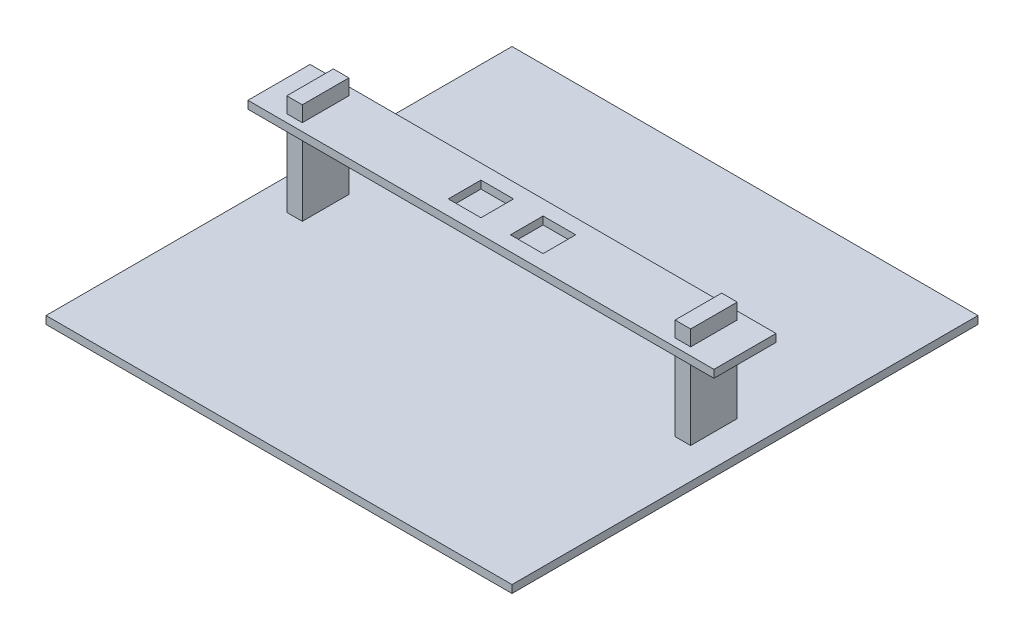
ISO-10303-21;
HEADER;
FILE_DESCRIPTION(('STEP AP214'),'2;1');
FILE_NAME('part.step','',(''),(''),'','','');
FILE_SCHEMA(('AUTOMOTIVE_DESIGN { 1 0 10303 214 1 1 1 1 }'));
ENDSEC;
DATA;
#1=APPLICATION_CONTEXT('core data for automotive mechanical design processes');
#2=APPLICATION_PROTOCOL_DEFINITION('international standard','automotive_design',2000,#1);
#3=PRODUCT_CONTEXT('',#1,'mechanical');
#4=PRODUCT('Part','Part','',(#3));
#5=PRODUCT_RELATED_PRODUCT_CATEGORY('part','',(#4));
#6=PRODUCT_DEFINITION_FORMATION('','',#4);
#7=PRODUCT_DEFINITION_CONTEXT('part definition',#1,'design');
#8=PRODUCT_DEFINITION('design','',#6,#7);
#9=PRODUCT_DEFINITION_SHAPE('','',#8);
#10=(LENGTH_UNIT() NAMED_UNIT(*) SI_UNIT(.MILLI.,.METRE.));
#11=(NAMED_UNIT(*) PLANE_ANGLE_UNIT() SI_UNIT($,.RADIAN.));
#12=(NAMED_UNIT(*) SI_UNIT($,.STERADIAN.) SOLID_ANGLE_UNIT());
#13=UNCERTAINTY_MEASURE_WITH_UNIT(LENGTH_MEASURE(1.E-05),#10,'distance_accuracy_value','');
#14=(GEOMETRIC_REPRESENTATION_CONTEXT(3) GLOBAL_UNCERTAINTY_ASSIGNED_CONTEXT((#13)) GLOBAL_UNIT_ASSIGNED_CONTEXT((#10,
#11,#12)) REPRESENTATION_CONTEXT('',''));
#15=CARTESIAN_POINT('',(0.,0.,0.));
#16=DIRECTION('',(0.,0.,1.));
#17=DIRECTION('',(1.,0.,0.));
#18=AXIS2_PLACEMENT_3D('',#15,#16,#17);
#19=CARTESIAN_POINT('',(0.,120.,0.));
#20=DIRECTION('',(0.,1.,0.));
#21=DIRECTION('',(0.,0.,1.));
#22=AXIS2_PLACEMENT_3D('',#19,#20,#21);
#23=PLANE('',#22);
#24=DIRECTION('',(0.,0.,1.));
#25=VECTOR('',#24,1.);
#26=CARTESIAN_POINT('',(-61.,120.,-21.));
#27=LINE('',#26,#25);
#28=CARTESIAN_POINT('',(-61.,120.,-21.));
#29=VERTEX_POINT('',#28);
#30=CARTESIAN_POINT('',(-61.,120.,21.));
#31=VERTEX_POINT('',#30);
#32=EDGE_CURVE('E64',#29,#31,#27,.T.);
#33=ORIENTED_EDGE('',*,*,#32,.F.);
#34=DIRECTION('',(-1.,0.,0.));
#35=VECTOR('',#34,1.);
#36=CARTESIAN_POINT('',(-19.,120.,-21.));
#37=LINE('',#36,#35);
#38=CARTESIAN_POINT('',(-19.,120.,-21.));
#39=VERTEX_POINT('',#38);
#40=EDGE_CURVE('E278',#39,#29,#37,.T.);
#41=ORIENTED_EDGE('',*,*,#40,.F.);
#42=DIRECTION('',(0.,0.,-1.));
#43=VECTOR('',#42,1.);
#44=CARTESIAN_POINT('',(-19.,120.,21.));
#45=LINE('',#44,#43);
#46=CARTESIAN_POINT('',(-19.,120.,21.));
#47=VERTEX_POINT('',#46);
#48=EDGE_CURVE('E282',#47,#39,#45,.T.);
#49=ORIENTED_EDGE('',*,*,#48,.F.);
#50=DIRECTION('',(1.,0.,0.));
#51=VECTOR('',#50,1.);
#52=CARTESIAN_POINT('',(-61.,120.,21.));
#53=LINE('',#52,#51);
#54=EDGE_CURVE('E286',#31,#47,#53,.T.);
#55=ORIENTED_EDGE('',*,*,#54,.F.);
#56=EDGE_LOOP('',(#33,#41,#49,#55));
#57=FACE_BOUND('',#56,.T.);
#58=DIRECTION('',(0.,0.,-1.));
#59=VECTOR('',#58,1.);
#60=CARTESIAN_POINT('',(61.0000000000001,120.,21.));
#61=LINE('',#60,#59);
#62=CARTESIAN_POINT('',(61.0000000000001,120.,21.));
#63=VERTEX_POINT('',#62);
#64=CARTESIAN_POINT('',(61.0000000000001,120.,-21.));
#65=VERTEX_POINT('',#64);
#66=EDGE_CURVE('E71',#63,#65,#61,.T.);
#67=ORIENTED_EDGE('',*,*,#66,.F.);
#68=DIRECTION('',(1.,0.,0.));
#69=VECTOR('',#68,1.);
#70=CARTESIAN_POINT('',(19.0000000000001,120.,21.));
#71=LINE('',#70,#69);
#72=CARTESIAN_POINT('',(19.0000000000001,120.,21.));
#73=VERTEX_POINT('',#72);
#74=EDGE_CURVE('E306',#73,#63,#71,.T.);
#75=ORIENTED_EDGE('',*,*,#74,.F.);
#76=DIRECTION('',(0.,0.,1.));
#77=VECTOR('',#76,1.);
#78=CARTESIAN_POINT('',(19.0000000000001,120.,-21.));
#79=LINE('',#78,#77);
#80=CARTESIAN_POINT('',(19.0000000000001,120.,-21.));
#81=VERTEX_POINT('',#80);
#82=EDGE_CURVE('E313',#81,#73,#79,.T.);
#83=ORIENTED_EDGE('',*,*,#82,.F.);
#84=DIRECTION('',(-1.,0.,0.));
#85=VECTOR('',#84,1.);
#86=CARTESIAN_POINT('',(61.0000000000001,120.,-21.));
#87=LINE('',#86,#85);
#88=EDGE_CURVE('E312',#65,#81,#87,.T.);
#89=ORIENTED_EDGE('',*,*,#88,.F.);
#90=EDGE_LOOP('',(#67,#75,#83,#89));
#91=FACE_BOUND('',#90,.T.);
#92=DIRECTION('',(0.,0.,-1.));
#93=VECTOR('',#92,1.);
#94=CARTESIAN_POINT('',(-240.,120.,30.));
#95=LINE('',#94,#93);
#96=CARTESIAN_POINT('',(-240.,120.,30.));
#97=VERTEX_POINT('',#96);
#98=CARTESIAN_POINT('',(-240.,120.,-30.));
#99=VERTEX_POINT('',#98);
#100=EDGE_CURVE('E369',#97,#99,#95,.T.);
#101=ORIENTED_EDGE('',*,*,#100,.F.);
#102=DIRECTION('',(1.,0.,0.));
#103=VECTOR('',#102,1.);
#104=CARTESIAN_POINT('',(-260.,120.,30.));
#105=LINE('',#104,#103);
#106=CARTESIAN_POINT('',(-260.,120.,30.));
#107=VERTEX_POINT('',#106);
#108=EDGE_CURVE('E368',#107,#97,#105,.T.);
#109=ORIENTED_EDGE('',*,*,#108,.F.);
#110=DIRECTION('',(0.,0.,1.));
#111=VECTOR('',#110,1.);
#112=CARTESIAN_POINT('',(-260.,120.,-30.));
#113=LINE('',#112,#111);
#114=CARTESIAN_POINT('',(-260.,120.,-30.));
#115=VERTEX_POINT('',#114);
#116=EDGE_CURVE('E376',#115,#107,#113,.T.);
#117=ORIENTED_EDGE('',*,*,#116,.F.);
#118=DIRECTION('',(-1.,0.,0.));
#119=VECTOR('',#118,1.);
#120=CARTESIAN_POINT('',(-240.,120.,-30.));
#121=LINE('',#120,#119);
#122=EDGE_CURVE('E373',#99,#115,#121,.T.);
#123=ORIENTED_EDGE('',*,*,#122,.F.);
#124=EDGE_LOOP('',(#101,#109,#117,#123));
#125=FACE_BOUND('',#124,.T.);
#126=DIRECTION('',(0.,0.,-1.));
#127=VECTOR('',#126,1.);
#128=CARTESIAN_POINT('',(260.,120.,30.));
#129=LINE('',#128,#127);
#130=CARTESIAN_POINT('',(260.,120.,30.));
#131=VERTEX_POINT('',#130);
#132=CARTESIAN_POINT('',(260.,120.,-30.));
#133=VERTEX_POINT('',#132);
#134=EDGE_CURVE('E351',#131,#133,#129,.T.);
#135=ORIENTED_EDGE('',*,*,#134,.F.);
#136=DIRECTION('',(1.,0.,0.));
#137=VECTOR('',#136,1.);
#138=CARTESIAN_POINT('',(240.,120.,30.));
#139=LINE('',#138,#137);
#140=CARTESIAN_POINT('',(240.,120.,30.));
#141=VERTEX_POINT('',#140);
#142=EDGE_CURVE('E349',#141,#131,#139,.T.);
#143=ORIENTED_EDGE('',*,*,#142,.F.);
#144=DIRECTION('',(0.,0.,1.));
#145=VECTOR('',#144,1.);
#146=CARTESIAN_POINT('',(240.,120.,-30.));
#147=LINE('',#146,#145);
#148=CARTESIAN_POINT('',(240.,120.,-30.));
#149=VERTEX_POINT('',#148);
#150=EDGE_CURVE('E357',#149,#141,#147,.T.);
#151=ORIENTED_EDGE('',*,*,#150,.F.);
#152=DIRECTION('',(-1.,0.,0.));
#153=VECTOR('',#152,1.);
#154=CARTESIAN_POINT('',(260.,120.,-30.));
#155=LINE('',#154,#153);
#156=EDGE_CURVE('E353',#133,#149,#155,.T.);
#157=ORIENTED_EDGE('',*,*,#156,.F.);
#158=EDGE_LOOP('',(#135,#143,#151,#157));
#159=FACE_BOUND('',#158,.T.);
#160=DIRECTION('',(0.,0.,-1.));
#161=VECTOR('',#160,1.);
#162=CARTESIAN_POINT('',(300.,120.,300.));
#163=LINE('',#162,#161);
#164=CARTESIAN_POINT('',(300.,120.,40.));
#165=VERTEX_POINT('',#164);
#166=CARTESIAN_POINT('',(300.,120.,-40.));
#167=VERTEX_POINT('',#166);
#168=EDGE_CURVE('E388',#165,#167,#163,.T.);
#169=ORIENTED_EDGE('',*,*,#168,.T.);
#170=DIRECTION('',(-1.,0.,0.));
#171=VECTOR('',#170,1.);
#172=CARTESIAN_POINT('',(-300.,120.,-40.));
#173=LINE('',#172,#171);
#174=CARTESIAN_POINT('',(-300.,120.,-40.));
#175=VERTEX_POINT('',#174);
#176=EDGE_CURVE('E335',#167,#175,#173,.T.);
#177=ORIENTED_EDGE('',*,*,#176,.T.);
#178=DIRECTION('',(0.,0.,1.));
#179=VECTOR('',#178,1.);
#180=CARTESIAN_POINT('',(-300.,120.,-300.));
#181=LINE('',#180,#179);
#182=CARTESIAN_POINT('',(-300.,120.,40.));
#183=VERTEX_POINT('',#182);
#184=EDGE_CURVE('E392',#175,#183,#181,.T.);
#185=ORIENTED_EDGE('',*,*,#184,.T.);
#186=DIRECTION('',(1.,0.,0.));
#187=VECTOR('',#186,1.);
#188=CARTESIAN_POINT('',(-300.,120.,40.));
#189=LINE('',#188,#187);
#190=EDGE_CURVE('E293',#183,#165,#189,.T.);
#191=ORIENTED_EDGE('',*,*,#190,.T.);
#192=EDGE_LOOP('',(#169,#177,#185,#191));
#193=FACE_BOUND('',#192,.T.);
#194=ADVANCED_FACE('F49',(#57,#91,#125,#159,#193),#23,.T.);
#195=CARTESIAN_POINT('',(0.,110.,0.));
#196=DIRECTION('',(0.,1.,0.));
#197=DIRECTION('',(0.,0.,1.));
#198=AXIS2_PLACEMENT_3D('',#195,#196,#197);
#199=PLANE('',#198);
#200=DIRECTION('',(-1.,0.,0.));
#201=VECTOR('',#200,1.);
#202=CARTESIAN_POINT('',(-19.,110.,-21.));
#203=LINE('',#202,#201);
#204=CARTESIAN_POINT('',(-19.,110.,-21.));
#205=VERTEX_POINT('',#204);
#206=CARTESIAN_POINT('',(-61.,110.,-21.));
#207=VERTEX_POINT('',#206);
#208=EDGE_CURVE('E270',#205,#207,#203,.T.);
#209=ORIENTED_EDGE('',*,*,#208,.T.);
#210=DIRECTION('',(0.,0.,1.));
#211=VECTOR('',#210,1.);
#212=CARTESIAN_POINT('',(-61.,110.,-21.));
#213=LINE('',#212,#211);
#214=CARTESIAN_POINT('',(-61.,110.,21.));
#215=VERTEX_POINT('',#214);
#216=EDGE_CURVE('E261',#207,#215,#213,.T.);
#217=ORIENTED_EDGE('',*,*,#216,.T.);
#218=DIRECTION('',(1.,0.,0.));
#219=VECTOR('',#218,1.);
#220=CARTESIAN_POINT('',(-61.,110.,21.));
#221=LINE('',#220,#219);
#222=CARTESIAN_POINT('',(-19.,110.,21.));
#223=VERTEX_POINT('',#222);
#224=EDGE_CURVE('E271',#215,#223,#221,.T.);
#225=ORIENTED_EDGE('',*,*,#224,.T.);
#226=DIRECTION('',(0.,0.,-1.));
#227=VECTOR('',#226,1.);
#228=CARTESIAN_POINT('',(-19.,110.,21.));
#229=LINE('',#228,#227);
#230=EDGE_CURVE('E274',#223,#205,#229,.T.);
#231=ORIENTED_EDGE('',*,*,#230,.T.);
#232=EDGE_LOOP('',(#209,#217,#225,#231));
#233=FACE_BOUND('',#232,.T.);
#234=DIRECTION('',(1.,0.,0.));
#235=VECTOR('',#234,1.);
#236=CARTESIAN_POINT('',(19.0000000000001,110.,21.));
#237=LINE('',#236,#235);
#238=CARTESIAN_POINT('',(19.0000000000001,110.,21.));
#239=VERTEX_POINT('',#238);
#240=CARTESIAN_POINT('',(61.0000000000001,110.,21.));
#241=VERTEX_POINT('',#240);
#242=EDGE_CURVE('E302',#239,#241,#237,.T.);
#243=ORIENTED_EDGE('',*,*,#242,.T.);
#244=DIRECTION('',(0.,0.,-1.));
#245=VECTOR('',#244,1.);
#246=CARTESIAN_POINT('',(61.0000000000001,110.,21.));
#247=LINE('',#246,#245);
#248=CARTESIAN_POINT('',(61.0000000000001,110.,-21.));
#249=VERTEX_POINT('',#248);
#250=EDGE_CURVE('E315',#241,#249,#247,.T.);
#251=ORIENTED_EDGE('',*,*,#250,.T.);
#252=DIRECTION('',(-1.,0.,0.));
#253=VECTOR('',#252,1.);
#254=CARTESIAN_POINT('',(61.0000000000001,110.,-21.));
#255=LINE('',#254,#253);
#256=CARTESIAN_POINT('',(19.0000000000001,110.,-21.));
#257=VERTEX_POINT('',#256);
#258=EDGE_CURVE('E322',#249,#257,#255,.T.);
#259=ORIENTED_EDGE('',*,*,#258,.T.);
#260=DIRECTION('',(0.,0.,1.));
#261=VECTOR('',#260,1.);
#262=CARTESIAN_POINT('',(19.0000000000001,110.,-21.));
#263=LINE('',#262,#261);
#264=EDGE_CURVE('E321',#257,#239,#263,.T.);
#265=ORIENTED_EDGE('',*,*,#264,.T.);
#266=EDGE_LOOP('',(#243,#251,#259,#265));
#267=FACE_BOUND('',#266,.T.);
#268=DIRECTION('',(1.,0.,0.));
#269=VECTOR('',#268,1.);
#270=CARTESIAN_POINT('',(-260.,110.,30.));
#271=LINE('',#270,#269);
#272=CARTESIAN_POINT('',(-260.,110.,30.));
#273=VERTEX_POINT('',#272);
#274=CARTESIAN_POINT('',(-240.,110.,30.));
#275=VERTEX_POINT('',#274);
#276=EDGE_CURVE('E356',#273,#275,#271,.T.);
#277=ORIENTED_EDGE('',*,*,#276,.T.);
#278=DIRECTION('',(0.,0.,-1.));
#279=VECTOR('',#278,1.);
#280=CARTESIAN_POINT('',(-240.,110.,30.));
#281=LINE('',#280,#279);
#282=CARTESIAN_POINT('',(-240.,110.,-30.));
#283=VERTEX_POINT('',#282);
#284=EDGE_CURVE('E385',#275,#283,#281,.T.);
#285=ORIENTED_EDGE('',*,*,#284,.T.);
#286=DIRECTION('',(-1.,0.,0.));
#287=VECTOR('',#286,1.);
#288=CARTESIAN_POINT('',(-240.,110.,-30.));
#289=LINE('',#288,#287);
#290=CARTESIAN_POINT('',(-260.,110.,-30.));
#291=VERTEX_POINT('',#290);
#292=EDGE_CURVE('E384',#283,#291,#289,.T.);
#293=ORIENTED_EDGE('',*,*,#292,.T.);
#294=DIRECTION('',(0.,0.,1.));
#295=VECTOR('',#294,1.);
#296=CARTESIAN_POINT('',(-260.,110.,-30.));
#297=LINE('',#296,#295);
#298=EDGE_CURVE('E367',#291,#273,#297,.T.);
#299=ORIENTED_EDGE('',*,*,#298,.T.);
#300=EDGE_LOOP('',(#277,#285,#293,#299));
#301=FACE_BOUND('',#300,.T.);
#302=DIRECTION('',(1.,0.,0.));
#303=VECTOR('',#302,1.);
#304=CARTESIAN_POINT('',(240.,110.,30.));
#305=LINE('',#304,#303);
#306=CARTESIAN_POINT('',(240.,110.,30.));
#307=VERTEX_POINT('',#306);
#308=CARTESIAN_POINT('',(260.,110.,30.));
#309=VERTEX_POINT('',#308);
#310=EDGE_CURVE('E342',#307,#309,#305,.T.);
#311=ORIENTED_EDGE('',*,*,#310,.T.);
#312=DIRECTION('',(0.,0.,-1.));
#313=VECTOR('',#312,1.);
#314=CARTESIAN_POINT('',(260.,110.,30.));
#315=LINE('',#314,#313);
#316=CARTESIAN_POINT('',(260.,110.,-30.));
#317=VERTEX_POINT('',#316);
#318=EDGE_CURVE('E363',#309,#317,#315,.T.);
#319=ORIENTED_EDGE('',*,*,#318,.T.);
#320=DIRECTION('',(-1.,0.,0.));
#321=VECTOR('',#320,1.);
#322=CARTESIAN_POINT('',(260.,110.,-30.));
#323=LINE('',#322,#321);
#324=CARTESIAN_POINT('',(240.,110.,-30.));
#325=VERTEX_POINT('',#324);
#326=EDGE_CURVE('E361',#317,#325,#323,.T.);
#327=ORIENTED_EDGE('',*,*,#326,.T.);
#328=DIRECTION('',(0.,0.,1.));
#329=VECTOR('',#328,1.);
#330=CARTESIAN_POINT('',(240.,110.,-30.));
#331=LINE('',#330,#329);
#332=EDGE_CURVE('E355',#325,#307,#331,.T.);
#333=ORIENTED_EDGE('',*,*,#332,.T.);
#334=EDGE_LOOP('',(#311,#319,#327,#333));
#335=FACE_BOUND('',#334,.T.);
#336=DIRECTION('',(-1.,0.,0.));
#337=VECTOR('',#336,1.);
#338=CARTESIAN_POINT('',(-300.,110.,-40.));
#339=LINE('',#338,#337);
#340=CARTESIAN_POINT('',(300.,110.,-40.));
#341=VERTEX_POINT('',#340);
#342=CARTESIAN_POINT('',(-300.,110.,-40.));
#343=VERTEX_POINT('',#342);
#344=EDGE_CURVE('E332',#341,#343,#339,.T.);
#345=ORIENTED_EDGE('',*,*,#344,.F.);
#346=DIRECTION('',(0.,0.,-1.));
#347=VECTOR('',#346,1.);
#348=CARTESIAN_POINT('',(300.,110.,300.));
#349=LINE('',#348,#347);
#350=CARTESIAN_POINT('',(300.,110.,40.));
#351=VERTEX_POINT('',#350);
#352=EDGE_CURVE('E377',#351,#341,#349,.T.);
#353=ORIENTED_EDGE('',*,*,#352,.F.);
#354=DIRECTION('',(1.,0.,0.));
#355=VECTOR('',#354,1.);
#356=CARTESIAN_POINT('',(-300.,110.,40.));
#357=LINE('',#356,#355);
#358=CARTESIAN_POINT('',(-300.,110.,40.));
#359=VERTEX_POINT('',#358);
#360=EDGE_CURVE('E328',#359,#351,#357,.T.);
#361=ORIENTED_EDGE('',*,*,#360,.F.);
#362=DIRECTION('',(0.,0.,1.));
#363=VECTOR('',#362,1.);
#364=CARTESIAN_POINT('',(-300.,110.,-300.));
#365=LINE('',#364,#363);
#366=EDGE_CURVE('E393',#343,#359,#365,.T.);
#367=ORIENTED_EDGE('',*,*,#366,.F.);
#368=EDGE_LOOP('',(#345,#353,#361,#367));
#369=FACE_BOUND('',#368,.T.);
#370=ADVANCED_FACE('F280',(#233,#267,#301,#335,#369),#199,.F.);
#371=CARTESIAN_POINT('',(300.,120.,300.));
#372=DIRECTION('',(-1.,0.,0.));
#373=DIRECTION('',(0.,0.,1.));
#374=AXIS2_PLACEMENT_3D('',#371,#372,#373);
#375=PLANE('',#374);
#376=ORIENTED_EDGE('',*,*,#352,.T.);
#377=DIRECTION('',(0.,1.,0.));
#378=VECTOR('',#377,1.);
#379=CARTESIAN_POINT('',(300.,110.,-40.));
#380=LINE('',#379,#378);
#381=EDGE_CURVE('E344',#341,#167,#380,.T.);
#382=ORIENTED_EDGE('',*,*,#381,.T.);
#383=ORIENTED_EDGE('',*,*,#168,.F.);
#384=DIRECTION('',(0.,1.,0.));
#385=VECTOR('',#384,1.);
#386=CARTESIAN_POINT('',(300.,110.,40.));
#387=LINE('',#386,#385);
#388=EDGE_CURVE('E343',#351,#165,#387,.T.);
#389=ORIENTED_EDGE('',*,*,#388,.F.);
#390=EDGE_LOOP('',(#376,#382,#383,#389));
#391=FACE_BOUND('',#390,.T.);
#392=ADVANCED_FACE('F532',(#391),#375,.F.);
#393=CARTESIAN_POINT('',(-300.,120.,-300.));
#394=DIRECTION('',(1.,0.,0.));
#395=DIRECTION('',(0.,0.,-1.));
#396=AXIS2_PLACEMENT_3D('',#393,#394,#395);
#397=PLANE('',#396);
#398=ORIENTED_EDGE('',*,*,#366,.T.);
#399=DIRECTION('',(0.,1.,0.));
#400=VECTOR('',#399,1.);
#401=CARTESIAN_POINT('',(-300.,110.,40.));
#402=LINE('',#401,#400);
#403=EDGE_CURVE('E331',#359,#183,#402,.T.);
#404=ORIENTED_EDGE('',*,*,#403,.T.);
#405=ORIENTED_EDGE('',*,*,#184,.F.);
#406=DIRECTION('',(0.,1.,0.));
#407=VECTOR('',#406,1.);
#408=CARTESIAN_POINT('',(-300.,110.,-40.));
#409=LINE('',#408,#407);
#410=EDGE_CURVE('E338',#343,#175,#409,.T.);
#411=ORIENTED_EDGE('',*,*,#410,.F.);
#412=EDGE_LOOP('',(#398,#404,#405,#411));
#413=FACE_BOUND('',#412,.T.);
#414=ADVANCED_FACE('F545',(#413),#397,.F.);
#415=CARTESIAN_POINT('',(260.,140.,0.));
#416=DIRECTION('',(1.,0.,0.));
#417=DIRECTION('',(0.,0.,-1.));
#418=AXIS2_PLACEMENT_3D('',#415,#416,#417);
#419=PLANE('',#418);
#420=DIRECTION('',(0.,-1.,0.));
#421=VECTOR('',#420,1.);
#422=CARTESIAN_POINT('',(260.,140.,-30.));
#423=LINE('',#422,#421);
#424=CARTESIAN_POINT('',(260.,10.,-30.));
#425=VERTEX_POINT('',#424);
#426=EDGE_CURVE('E475',#317,#425,#423,.T.);
#427=ORIENTED_EDGE('',*,*,#426,.F.);
#428=ORIENTED_EDGE('',*,*,#318,.F.);
#429=DIRECTION('',(0.,-1.,0.));
#430=VECTOR('',#429,1.);
#431=CARTESIAN_POINT('',(260.,140.,30.));
#432=LINE('',#431,#430);
#433=CARTESIAN_POINT('',(260.,10.,30.));
#434=VERTEX_POINT('',#433);
#435=EDGE_CURVE('E455',#309,#434,#432,.T.);
#436=ORIENTED_EDGE('',*,*,#435,.T.);
#437=DIRECTION('',(0.,0.,1.));
#438=VECTOR('',#437,1.);
#439=CARTESIAN_POINT('',(260.,10.,0.));
#440=LINE('',#439,#438);
#441=EDGE_CURVE('E399',#425,#434,#440,.T.);
#442=ORIENTED_EDGE('',*,*,#441,.F.);
#443=EDGE_LOOP('',(#427,#428,#436,#442));
#444=FACE_BOUND('',#443,.T.);
#445=ADVANCED_FACE('F544',(#444),#419,.T.);
#446=CARTESIAN_POINT('',(0.,140.,-30.));
#447=DIRECTION('',(0.,0.,1.));
#448=DIRECTION('',(1.,0.,0.));
#449=AXIS2_PLACEMENT_3D('',#446,#447,#448);
#450=PLANE('',#449);
#451=ORIENTED_EDGE('',*,*,#326,.F.);
#452=ORIENTED_EDGE('',*,*,#426,.T.);
#453=DIRECTION('',(-1.,0.,0.));
#454=VECTOR('',#453,1.);
#455=CARTESIAN_POINT('',(0.,10.,-30.));
#456=LINE('',#455,#454);
#457=CARTESIAN_POINT('',(240.,10.,-30.));
#458=VERTEX_POINT('',#457);
#459=EDGE_CURVE('E457',#425,#458,#456,.T.);
#460=ORIENTED_EDGE('',*,*,#459,.T.);
#461=DIRECTION('',(0.,-1.,0.));
#462=VECTOR('',#461,1.);
#463=CARTESIAN_POINT('',(240.,140.,-30.));
#464=LINE('',#463,#462);
#465=EDGE_CURVE('E468',#325,#458,#464,.T.);
#466=ORIENTED_EDGE('',*,*,#465,.F.);
#467=EDGE_LOOP('',(#451,#452,#460,#466));
#468=FACE_BOUND('',#467,.T.);
#469=ADVANCED_FACE('F593',(#468),#450,.F.);
#470=CARTESIAN_POINT('',(240.,140.,0.));
#471=DIRECTION('',(1.,0.,0.));
#472=DIRECTION('',(0.,0.,-1.));
#473=AXIS2_PLACEMENT_3D('',#470,#471,#472);
#474=PLANE('',#473);
#475=ORIENTED_EDGE('',*,*,#332,.F.);
#476=ORIENTED_EDGE('',*,*,#465,.T.);
#477=DIRECTION('',(0.,0.,1.));
#478=VECTOR('',#477,1.);
#479=CARTESIAN_POINT('',(240.,10.,0.));
#480=LINE('',#479,#478);
#481=CARTESIAN_POINT('',(240.,10.,30.));
#482=VERTEX_POINT('',#481);
#483=EDGE_CURVE('E459',#458,#482,#480,.T.);
#484=ORIENTED_EDGE('',*,*,#483,.T.);
#485=DIRECTION('',(0.,-1.,0.));
#486=VECTOR('',#485,1.);
#487=CARTESIAN_POINT('',(240.,140.,30.));
#488=LINE('',#487,#486);
#489=EDGE_CURVE('E469',#307,#482,#488,.T.);
#490=ORIENTED_EDGE('',*,*,#489,.F.);
#491=EDGE_LOOP('',(#475,#476,#484,#490));
#492=FACE_BOUND('',#491,.T.);
#493=ADVANCED_FACE('F586',(#492),#474,.F.);
#494=CARTESIAN_POINT('',(0.,140.,30.));
#495=DIRECTION('',(0.,0.,1.));
#496=DIRECTION('',(1.,0.,0.));
#497=AXIS2_PLACEMENT_3D('',#494,#495,#496);
#498=PLANE('',#497);
#499=ORIENTED_EDGE('',*,*,#435,.F.);
#500=ORIENTED_EDGE('',*,*,#310,.F.);
#501=ORIENTED_EDGE('',*,*,#489,.T.);
#502=DIRECTION('',(-1.,0.,0.));
#503=VECTOR('',#502,1.);
#504=CARTESIAN_POINT('',(0.,10.,30.));
#505=LINE('',#504,#503);
#506=EDGE_CURVE('E446',#434,#482,#505,.T.);
#507=ORIENTED_EDGE('',*,*,#506,.F.);
#508=EDGE_LOOP('',(#499,#500,#501,#507));
#509=FACE_BOUND('',#508,.T.);
#510=ADVANCED_FACE('F581',(#509),#498,.T.);
#511=CARTESIAN_POINT('',(-240.,140.,0.));
#512=DIRECTION('',(1.,0.,0.));
#513=DIRECTION('',(0.,0.,-1.));
#514=AXIS2_PLACEMENT_3D('',#511,#512,#513);
#515=PLANE('',#514);
#516=DIRECTION('',(0.,-1.,0.));
#517=VECTOR('',#516,1.);
#518=CARTESIAN_POINT('',(-240.,140.,-30.));
#519=LINE('',#518,#517);
#520=CARTESIAN_POINT('',(-240.,10.,-30.));
#521=VERTEX_POINT('',#520);
#522=EDGE_CURVE('E440',#283,#521,#519,.T.);
#523=ORIENTED_EDGE('',*,*,#522,.F.);
#524=ORIENTED_EDGE('',*,*,#284,.F.);
#525=DIRECTION('',(0.,-1.,0.));
#526=VECTOR('',#525,1.);
#527=CARTESIAN_POINT('',(-240.,140.,30.));
#528=LINE('',#527,#526);
#529=CARTESIAN_POINT('',(-240.,10.,30.));
#530=VERTEX_POINT('',#529);
#531=EDGE_CURVE('E415',#275,#530,#528,.T.);
#532=ORIENTED_EDGE('',*,*,#531,.T.);
#533=DIRECTION('',(0.,0.,1.));
#534=VECTOR('',#533,1.);
#535=CARTESIAN_POINT('',(-240.,10.,0.));
#536=LINE('',#535,#534);
#537=EDGE_CURVE('E411',#521,#530,#536,.T.);
#538=ORIENTED_EDGE('',*,*,#537,.F.);
#539=EDGE_LOOP('',(#523,#524,#532,#538));
#540=FACE_BOUND('',#539,.T.);
#541=ADVANCED_FACE('F573',(#540),#515,.T.);
#542=CARTESIAN_POINT('',(0.,140.,-30.));
#543=DIRECTION('',(0.,0.,-1.));
#544=DIRECTION('',(-1.,0.,0.));
#545=AXIS2_PLACEMENT_3D('',#542,#543,#544);
#546=PLANE('',#545);
#547=DIRECTION('',(0.,-1.,0.));
#548=VECTOR('',#547,1.);
#549=CARTESIAN_POINT('',(-260.,140.,-30.));
#550=LINE('',#549,#548);
#551=CARTESIAN_POINT('',(-260.,10.,-30.));
#552=VERTEX_POINT('',#551);
#553=EDGE_CURVE('E433',#291,#552,#550,.T.);
#554=ORIENTED_EDGE('',*,*,#553,.F.);
#555=ORIENTED_EDGE('',*,*,#292,.F.);
#556=ORIENTED_EDGE('',*,*,#522,.T.);
#557=DIRECTION('',(1.,0.,0.));
#558=VECTOR('',#557,1.);
#559=CARTESIAN_POINT('',(0.,10.,-30.));
#560=LINE('',#559,#558);
#561=EDGE_CURVE('E417',#552,#521,#560,.T.);
#562=ORIENTED_EDGE('',*,*,#561,.F.);
#563=EDGE_LOOP('',(#554,#555,#556,#562));
#564=FACE_BOUND('',#563,.T.);
#565=ADVANCED_FACE('F569',(#564),#546,.T.);
#566=CARTESIAN_POINT('',(-260.,140.,0.));
#567=DIRECTION('',(1.,0.,0.));
#568=DIRECTION('',(0.,0.,-1.));
#569=AXIS2_PLACEMENT_3D('',#566,#567,#568);
#570=PLANE('',#569);
#571=ORIENTED_EDGE('',*,*,#298,.F.);
#572=ORIENTED_EDGE('',*,*,#553,.T.);
#573=DIRECTION('',(0.,0.,1.));
#574=VECTOR('',#573,1.);
#575=CARTESIAN_POINT('',(-260.,10.,0.));
#576=LINE('',#575,#574);
#577=CARTESIAN_POINT('',(-260.,10.,30.));
#578=VERTEX_POINT('',#577);
#579=EDGE_CURVE('E423',#552,#578,#576,.T.);
#580=ORIENTED_EDGE('',*,*,#579,.T.);
#581=DIRECTION('',(0.,-1.,0.));
#582=VECTOR('',#581,1.);
#583=CARTESIAN_POINT('',(-260.,140.,30.));
#584=LINE('',#583,#582);
#585=EDGE_CURVE('E427',#273,#578,#584,.T.);
#586=ORIENTED_EDGE('',*,*,#585,.F.);
#587=EDGE_LOOP('',(#571,#572,#580,#586));
#588=FACE_BOUND('',#587,.T.);
#589=ADVANCED_FACE('F561',(#588),#570,.F.);
#590=CARTESIAN_POINT('',(0.,140.,30.));
#591=DIRECTION('',(0.,0.,-1.));
#592=DIRECTION('',(-1.,0.,0.));
#593=AXIS2_PLACEMENT_3D('',#590,#591,#592);
#594=PLANE('',#593);
#595=ORIENTED_EDGE('',*,*,#276,.F.);
#596=ORIENTED_EDGE('',*,*,#585,.T.);
#597=DIRECTION('',(1.,0.,0.));
#598=VECTOR('',#597,1.);
#599=CARTESIAN_POINT('',(0.,10.,30.));
#600=LINE('',#599,#598);
#601=EDGE_CURVE('E406',#578,#530,#600,.T.);
#602=ORIENTED_EDGE('',*,*,#601,.T.);
#603=ORIENTED_EDGE('',*,*,#531,.F.);
#604=EDGE_LOOP('',(#595,#596,#602,#603));
#605=FACE_BOUND('',#604,.T.);
#606=ADVANCED_FACE('F558',(#605),#594,.F.);
#607=CARTESIAN_POINT('',(0.,10.,0.));
#608=DIRECTION('',(0.,1.,0.));
#609=DIRECTION('',(0.,0.,1.));
#610=AXIS2_PLACEMENT_3D('',#607,#608,#609);
#611=PLANE('',#610);
#612=DIRECTION('',(0.,0.,-1.));
#613=VECTOR('',#612,1.);
#614=CARTESIAN_POINT('',(300.,10.,-300.));
#615=LINE('',#614,#613);
#616=CARTESIAN_POINT('',(300.,10.,300.));
#617=VERTEX_POINT('',#616);
#618=CARTESIAN_POINT('',(300.,10.,-300.));
#619=VERTEX_POINT('',#618);
#620=EDGE_CURVE('E480',#617,#619,#615,.T.);
#621=ORIENTED_EDGE('',*,*,#620,.T.);
#622=DIRECTION('',(-1.,0.,0.));
#623=VECTOR('',#622,1.);
#624=CARTESIAN_POINT('',(-300.,10.,-300.));
#625=LINE('',#624,#623);
#626=CARTESIAN_POINT('',(-300.,10.,-300.));
#627=VERTEX_POINT('',#626);
#628=EDGE_CURVE('E477',#619,#627,#625,.T.);
#629=ORIENTED_EDGE('',*,*,#628,.T.);
#630=DIRECTION('',(0.,0.,1.));
#631=VECTOR('',#630,1.);
#632=CARTESIAN_POINT('',(-300.,10.,-300.));
#633=LINE('',#632,#631);
#634=CARTESIAN_POINT('',(-300.,10.,300.));
#635=VERTEX_POINT('',#634);
#636=EDGE_CURVE('E483',#627,#635,#633,.T.);
#637=ORIENTED_EDGE('',*,*,#636,.T.);
#638=DIRECTION('',(1.,0.,0.));
#639=VECTOR('',#638,1.);
#640=CARTESIAN_POINT('',(-300.,10.,300.));
#641=LINE('',#640,#639);
#642=EDGE_CURVE('E484',#635,#617,#641,.T.);
#643=ORIENTED_EDGE('',*,*,#642,.T.);
#644=EDGE_LOOP('',(#621,#629,#637,#643));
#645=FACE_BOUND('',#644,.T.);
#646=ORIENTED_EDGE('',*,*,#459,.F.);
#647=ORIENTED_EDGE('',*,*,#441,.T.);
#648=ORIENTED_EDGE('',*,*,#506,.T.);
#649=ORIENTED_EDGE('',*,*,#483,.F.);
#650=EDGE_LOOP('',(#646,#647,#648,#649));
#651=FACE_BOUND('',#650,.T.);
#652=ORIENTED_EDGE('',*,*,#561,.T.);
#653=ORIENTED_EDGE('',*,*,#537,.T.);
#654=ORIENTED_EDGE('',*,*,#601,.F.);
#655=ORIENTED_EDGE('',*,*,#579,.F.);
#656=EDGE_LOOP('',(#652,#653,#654,#655));
#657=FACE_BOUND('',#656,.T.);
#658=ADVANCED_FACE('F518',(#645,#651,#657),#611,.T.);
#659=CARTESIAN_POINT('',(300.,10.,-300.));
#660=DIRECTION('',(-1.,0.,0.));
#661=DIRECTION('',(0.,0.,1.));
#662=AXIS2_PLACEMENT_3D('',#659,#660,#661);
#663=PLANE('',#662);
#664=DIRECTION('',(0.,0.,-1.));
#665=VECTOR('',#664,1.);
#666=CARTESIAN_POINT('',(300.,0.,-300.));
#667=LINE('',#666,#665);
#668=CARTESIAN_POINT('',(300.,0.,300.));
#669=VERTEX_POINT('',#668);
#670=CARTESIAN_POINT('',(300.,0.,-300.));
#671=VERTEX_POINT('',#670);
#672=EDGE_CURVE('E442',#669,#671,#667,.T.);
#673=ORIENTED_EDGE('',*,*,#672,.T.);
#674=DIRECTION('',(0.,-1.,0.));
#675=VECTOR('',#674,1.);
#676=CARTESIAN_POINT('',(300.,10.,-300.));
#677=LINE('',#676,#675);
#678=EDGE_CURVE('E12',#619,#671,#677,.T.);
#679=ORIENTED_EDGE('',*,*,#678,.F.);
#680=ORIENTED_EDGE('',*,*,#620,.F.);
#681=DIRECTION('',(0.,-1.,0.));
#682=VECTOR('',#681,1.);
#683=CARTESIAN_POINT('',(300.,10.,300.));
#684=LINE('',#683,#682);
#685=EDGE_CURVE('E490',#617,#669,#684,.T.);
#686=ORIENTED_EDGE('',*,*,#685,.T.);
#687=EDGE_LOOP('',(#673,#679,#680,#686));
#688=FACE_BOUND('',#687,.T.);
#689=ADVANCED_FACE('F55',(#688),#663,.F.);
#690=CARTESIAN_POINT('',(-300.,10.,-300.));
#691=DIRECTION('',(0.,0.,1.));
#692=DIRECTION('',(1.,0.,0.));
#693=AXIS2_PLACEMENT_3D('',#690,#691,#692);
#694=PLANE('',#693);
#695=DIRECTION('',(-1.,0.,0.));
#696=VECTOR('',#695,1.);
#697=CARTESIAN_POINT('',(-300.,0.,-300.));
#698=LINE('',#697,#696);
#699=CARTESIAN_POINT('',(-300.,0.,-300.));
#700=VERTEX_POINT('',#699);
#701=EDGE_CURVE('E489',#671,#700,#698,.T.);
#702=ORIENTED_EDGE('',*,*,#701,.T.);
#703=DIRECTION('',(0.,-1.,0.));
#704=VECTOR('',#703,1.);
#705=CARTESIAN_POINT('',(-300.,10.,-300.));
#706=LINE('',#705,#704);
#707=EDGE_CURVE('E59',#627,#700,#706,.T.);
#708=ORIENTED_EDGE('',*,*,#707,.F.);
#709=ORIENTED_EDGE('',*,*,#628,.F.);
#710=ORIENTED_EDGE('',*,*,#678,.T.);
#711=EDGE_LOOP('',(#702,#708,#709,#710));
#712=FACE_BOUND('',#711,.T.);
#713=ADVANCED_FACE('F522',(#712),#694,.F.);
#714=CARTESIAN_POINT('',(-300.,10.,-300.));
#715=DIRECTION('',(1.,0.,0.));
#716=DIRECTION('',(0.,0.,-1.));
#717=AXIS2_PLACEMENT_3D('',#714,#715,#716);
#718=PLANE('',#717);
#719=DIRECTION('',(0.,0.,1.));
#720=VECTOR('',#719,1.);
#721=CARTESIAN_POINT('',(-300.,0.,-300.));
#722=LINE('',#721,#720);
#723=CARTESIAN_POINT('',(-300.,0.,300.));
#724=VERTEX_POINT('',#723);
#725=EDGE_CURVE('E495',#700,#724,#722,.T.);
#726=ORIENTED_EDGE('',*,*,#725,.T.);
#727=DIRECTION('',(0.,-1.,0.));
#728=VECTOR('',#727,1.);
#729=CARTESIAN_POINT('',(-300.,10.,300.));
#730=LINE('',#729,#728);
#731=EDGE_CURVE('E500',#635,#724,#730,.T.);
#732=ORIENTED_EDGE('',*,*,#731,.F.);
#733=ORIENTED_EDGE('',*,*,#636,.F.);
#734=ORIENTED_EDGE('',*,*,#707,.T.);
#735=EDGE_LOOP('',(#726,#732,#733,#734));
#736=FACE_BOUND('',#735,.T.);
#737=ADVANCED_FACE('F503',(#736),#718,.F.);
#738=CARTESIAN_POINT('',(-300.,10.,300.));
#739=DIRECTION('',(0.,0.,-1.));
#740=DIRECTION('',(-1.,0.,0.));
#741=AXIS2_PLACEMENT_3D('',#738,#739,#740);
#742=PLANE('',#741);
#743=DIRECTION('',(1.,0.,0.));
#744=VECTOR('',#743,1.);
#745=CARTESIAN_POINT('',(-300.,0.,300.));
#746=LINE('',#745,#744);
#747=EDGE_CURVE('E481',#724,#669,#746,.T.);
#748=ORIENTED_EDGE('',*,*,#747,.T.);
#749=ORIENTED_EDGE('',*,*,#685,.F.);
#750=ORIENTED_EDGE('',*,*,#642,.F.);
#751=ORIENTED_EDGE('',*,*,#731,.T.);
#752=EDGE_LOOP('',(#748,#749,#750,#751));
#753=FACE_BOUND('',#752,.T.);
#754=ADVANCED_FACE('F511',(#753),#742,.F.);
#755=CARTESIAN_POINT('',(0.,0.,0.));
#756=DIRECTION('',(0.,1.,0.));
#757=DIRECTION('',(0.,0.,1.));
#758=AXIS2_PLACEMENT_3D('',#755,#756,#757);
#759=PLANE('',#758);
#760=ORIENTED_EDGE('',*,*,#672,.F.);
#761=ORIENTED_EDGE('',*,*,#747,.F.);
#762=ORIENTED_EDGE('',*,*,#725,.F.);
#763=ORIENTED_EDGE('',*,*,#701,.F.);
#764=EDGE_LOOP('',(#760,#761,#762,#763));
#765=FACE_BOUND('',#764,.T.);
#766=ADVANCED_FACE('F508',(#765),#759,.F.);
#767=CARTESIAN_POINT('',(0.,140.,0.));
#768=DIRECTION('',(0.,1.,0.));
#769=DIRECTION('',(0.,0.,1.));
#770=AXIS2_PLACEMENT_3D('',#767,#768,#769);
#771=PLANE('',#770);
#772=DIRECTION('',(0.,0.,1.));
#773=VECTOR('',#772,1.);
#774=CARTESIAN_POINT('',(-240.,140.,0.));
#775=LINE('',#774,#773);
#776=CARTESIAN_POINT('',(-240.,140.,-30.));
#777=VERTEX_POINT('',#776);
#778=CARTESIAN_POINT('',(-240.,140.,30.));
#779=VERTEX_POINT('',#778);
#780=EDGE_CURVE('E405',#777,#779,#775,.T.);
#781=ORIENTED_EDGE('',*,*,#780,.F.);
#782=DIRECTION('',(1.,0.,0.));
#783=VECTOR('',#782,1.);
#784=CARTESIAN_POINT('',(0.,140.,-30.));
#785=LINE('',#784,#783);
#786=CARTESIAN_POINT('',(-260.,140.,-30.));
#787=VERTEX_POINT('',#786);
#788=EDGE_CURVE('E403',#787,#777,#785,.T.);
#789=ORIENTED_EDGE('',*,*,#788,.F.);
#790=DIRECTION('',(0.,0.,1.));
#791=VECTOR('',#790,1.);
#792=CARTESIAN_POINT('',(-260.,140.,0.));
#793=LINE('',#792,#791);
#794=CARTESIAN_POINT('',(-260.,140.,30.));
#795=VERTEX_POINT('',#794);
#796=EDGE_CURVE('E408',#787,#795,#793,.T.);
#797=ORIENTED_EDGE('',*,*,#796,.T.);
#798=DIRECTION('',(1.,0.,0.));
#799=VECTOR('',#798,1.);
#800=CARTESIAN_POINT('',(0.,140.,30.));
#801=LINE('',#800,#799);
#802=EDGE_CURVE('E412',#795,#779,#801,.T.);
#803=ORIENTED_EDGE('',*,*,#802,.T.);
#804=EDGE_LOOP('',(#781,#789,#797,#803));
#805=FACE_BOUND('',#804,.T.);
#806=ADVANCED_FACE('F549',(#805),#771,.T.);
#807=EDGE_CURVE('E429',#795,#107,#584,.T.);
#808=ORIENTED_EDGE('',*,*,#807,.T.);
#809=ORIENTED_EDGE('',*,*,#108,.T.);
#810=EDGE_CURVE('E426',#779,#97,#528,.T.);
#811=ORIENTED_EDGE('',*,*,#810,.F.);
#812=ORIENTED_EDGE('',*,*,#802,.F.);
#813=EDGE_LOOP('',(#808,#809,#811,#812));
#814=FACE_BOUND('',#813,.T.);
#815=ADVANCED_FACE('F554',(#814),#594,.F.);
#816=EDGE_CURVE('E432',#787,#115,#550,.T.);
#817=ORIENTED_EDGE('',*,*,#816,.T.);
#818=ORIENTED_EDGE('',*,*,#116,.T.);
#819=ORIENTED_EDGE('',*,*,#807,.F.);
#820=ORIENTED_EDGE('',*,*,#796,.F.);
#821=EDGE_LOOP('',(#817,#818,#819,#820));
#822=FACE_BOUND('',#821,.T.);
#823=ADVANCED_FACE('F560',(#822),#570,.F.);
#824=ORIENTED_EDGE('',*,*,#122,.T.);
#825=ORIENTED_EDGE('',*,*,#816,.F.);
#826=ORIENTED_EDGE('',*,*,#788,.T.);
#827=EDGE_CURVE('E437',#777,#99,#519,.T.);
#828=ORIENTED_EDGE('',*,*,#827,.T.);
#829=EDGE_LOOP('',(#824,#825,#826,#828));
#830=FACE_BOUND('',#829,.T.);
#831=ADVANCED_FACE('F564',(#830),#546,.T.);
#832=ORIENTED_EDGE('',*,*,#100,.T.);
#833=ORIENTED_EDGE('',*,*,#827,.F.);
#834=ORIENTED_EDGE('',*,*,#780,.T.);
#835=ORIENTED_EDGE('',*,*,#810,.T.);
#836=EDGE_LOOP('',(#832,#833,#834,#835));
#837=FACE_BOUND('',#836,.T.);
#838=ADVANCED_FACE('F570',(#837),#515,.T.);
#839=CARTESIAN_POINT('',(0.,140.,0.));
#840=DIRECTION('',(0.,1.,0.));
#841=DIRECTION('',(0.,0.,1.));
#842=AXIS2_PLACEMENT_3D('',#839,#840,#841);
#843=PLANE('',#842);
#844=DIRECTION('',(0.,0.,1.));
#845=VECTOR('',#844,1.);
#846=CARTESIAN_POINT('',(260.,140.,0.));
#847=LINE('',#846,#845);
#848=CARTESIAN_POINT('',(260.,140.,-30.));
#849=VERTEX_POINT('',#848);
#850=CARTESIAN_POINT('',(260.,140.,30.));
#851=VERTEX_POINT('',#850);
#852=EDGE_CURVE('E445',#849,#851,#847,.T.);
#853=ORIENTED_EDGE('',*,*,#852,.F.);
#854=DIRECTION('',(-1.,0.,0.));
#855=VECTOR('',#854,1.);
#856=CARTESIAN_POINT('',(0.,140.,-30.));
#857=LINE('',#856,#855);
#858=CARTESIAN_POINT('',(240.,140.,-30.));
#859=VERTEX_POINT('',#858);
#860=EDGE_CURVE('E443',#849,#859,#857,.T.);
#861=ORIENTED_EDGE('',*,*,#860,.T.);
#862=DIRECTION('',(0.,0.,1.));
#863=VECTOR('',#862,1.);
#864=CARTESIAN_POINT('',(240.,140.,0.));
#865=LINE('',#864,#863);
#866=CARTESIAN_POINT('',(240.,140.,30.));
#867=VERTEX_POINT('',#866);
#868=EDGE_CURVE('E447',#859,#867,#865,.T.);
#869=ORIENTED_EDGE('',*,*,#868,.T.);
#870=DIRECTION('',(-1.,0.,0.));
#871=VECTOR('',#870,1.);
#872=CARTESIAN_POINT('',(0.,140.,30.));
#873=LINE('',#872,#871);
#874=EDGE_CURVE('E449',#851,#867,#873,.T.);
#875=ORIENTED_EDGE('',*,*,#874,.F.);
#876=EDGE_LOOP('',(#853,#861,#869,#875));
#877=FACE_BOUND('',#876,.T.);
#878=ADVANCED_FACE('F575',(#877),#843,.T.);
#879=ORIENTED_EDGE('',*,*,#142,.T.);
#880=EDGE_CURVE('E463',#851,#131,#432,.T.);
#881=ORIENTED_EDGE('',*,*,#880,.F.);
#882=ORIENTED_EDGE('',*,*,#874,.T.);
#883=EDGE_CURVE('E470',#867,#141,#488,.T.);
#884=ORIENTED_EDGE('',*,*,#883,.T.);
#885=EDGE_LOOP('',(#879,#881,#882,#884));
#886=FACE_BOUND('',#885,.T.);
#887=ADVANCED_FACE('F579',(#886),#498,.T.);
#888=EDGE_CURVE('E473',#859,#149,#464,.T.);
#889=ORIENTED_EDGE('',*,*,#888,.T.);
#890=ORIENTED_EDGE('',*,*,#150,.T.);
#891=ORIENTED_EDGE('',*,*,#883,.F.);
#892=ORIENTED_EDGE('',*,*,#868,.F.);
#893=EDGE_LOOP('',(#889,#890,#891,#892));
#894=FACE_BOUND('',#893,.T.);
#895=ADVANCED_FACE('F583',(#894),#474,.F.);
#896=EDGE_CURVE('E416',#849,#133,#423,.T.);
#897=ORIENTED_EDGE('',*,*,#896,.T.);
#898=ORIENTED_EDGE('',*,*,#156,.T.);
#899=ORIENTED_EDGE('',*,*,#888,.F.);
#900=ORIENTED_EDGE('',*,*,#860,.F.);
#901=EDGE_LOOP('',(#897,#898,#899,#900));
#902=FACE_BOUND('',#901,.T.);
#903=ADVANCED_FACE('F588',(#902),#450,.F.);
#904=ORIENTED_EDGE('',*,*,#134,.T.);
#905=ORIENTED_EDGE('',*,*,#896,.F.);
#906=ORIENTED_EDGE('',*,*,#852,.T.);
#907=ORIENTED_EDGE('',*,*,#880,.T.);
#908=EDGE_LOOP('',(#904,#905,#906,#907));
#909=FACE_BOUND('',#908,.T.);
#910=ADVANCED_FACE('F591',(#909),#419,.T.);
#911=CARTESIAN_POINT('',(-300.,110.,-40.));
#912=DIRECTION('',(0.,0.,-1.));
#913=DIRECTION('',(-1.,0.,0.));
#914=AXIS2_PLACEMENT_3D('',#911,#912,#913);
#915=PLANE('',#914);
#916=ORIENTED_EDGE('',*,*,#176,.F.);
#917=ORIENTED_EDGE('',*,*,#381,.F.);
#918=ORIENTED_EDGE('',*,*,#344,.T.);
#919=ORIENTED_EDGE('',*,*,#410,.T.);
#920=EDGE_LOOP('',(#916,#917,#918,#919));
#921=FACE_BOUND('',#920,.T.);
#922=ADVANCED_FACE('F596',(#921),#915,.T.);
#923=CARTESIAN_POINT('',(-300.,110.,40.));
#924=DIRECTION('',(0.,0.,1.));
#925=DIRECTION('',(1.,0.,0.));
#926=AXIS2_PLACEMENT_3D('',#923,#924,#925);
#927=PLANE('',#926);
#928=ORIENTED_EDGE('',*,*,#190,.F.);
#929=ORIENTED_EDGE('',*,*,#403,.F.);
#930=ORIENTED_EDGE('',*,*,#360,.T.);
#931=ORIENTED_EDGE('',*,*,#388,.T.);
#932=EDGE_LOOP('',(#928,#929,#930,#931));
#933=FACE_BOUND('',#932,.T.);
#934=ADVANCED_FACE('F537',(#933),#927,.T.);
#935=CARTESIAN_POINT('',(61.0000000000001,110.,21.));
#936=DIRECTION('',(1.,0.,0.));
#937=DIRECTION('',(0.,0.,-1.));
#938=AXIS2_PLACEMENT_3D('',#935,#936,#937);
#939=PLANE('',#938);
#940=ORIENTED_EDGE('',*,*,#66,.T.);
#941=DIRECTION('',(0.,1.,0.));
#942=VECTOR('',#941,1.);
#943=CARTESIAN_POINT('',(61.0000000000001,110.,-21.));
#944=LINE('',#943,#942);
#945=EDGE_CURVE('E298',#249,#65,#944,.T.);
#946=ORIENTED_EDGE('',*,*,#945,.F.);
#947=ORIENTED_EDGE('',*,*,#250,.F.);
#948=DIRECTION('',(0.,1.,0.));
#949=VECTOR('',#948,1.);
#950=CARTESIAN_POINT('',(61.0000000000001,110.,21.));
#951=LINE('',#950,#949);
#952=EDGE_CURVE('E308',#241,#63,#951,.T.);
#953=ORIENTED_EDGE('',*,*,#952,.T.);
#954=EDGE_LOOP('',(#940,#946,#947,#953));
#955=FACE_BOUND('',#954,.T.);
#956=ADVANCED_FACE('F678',(#955),#939,.F.);
#957=CARTESIAN_POINT('',(19.0000000000001,110.,21.));
#958=DIRECTION('',(0.,0.,1.));
#959=DIRECTION('',(1.,0.,0.));
#960=AXIS2_PLACEMENT_3D('',#957,#958,#959);
#961=PLANE('',#960);
#962=ORIENTED_EDGE('',*,*,#74,.T.);
#963=ORIENTED_EDGE('',*,*,#952,.F.);
#964=ORIENTED_EDGE('',*,*,#242,.F.);
#965=DIRECTION('',(0.,1.,0.));
#966=VECTOR('',#965,1.);
#967=CARTESIAN_POINT('',(19.0000000000001,110.,21.));
#968=LINE('',#967,#966);
#969=EDGE_CURVE('E301',#239,#73,#968,.T.);
#970=ORIENTED_EDGE('',*,*,#969,.T.);
#971=EDGE_LOOP('',(#962,#963,#964,#970));
#972=FACE_BOUND('',#971,.T.);
#973=ADVANCED_FACE('F692',(#972),#961,.F.);
#974=CARTESIAN_POINT('',(19.0000000000001,110.,-21.));
#975=DIRECTION('',(-1.,0.,0.));
#976=DIRECTION('',(0.,0.,1.));
#977=AXIS2_PLACEMENT_3D('',#974,#975,#976);
#978=PLANE('',#977);
#979=ORIENTED_EDGE('',*,*,#82,.T.);
#980=ORIENTED_EDGE('',*,*,#969,.F.);
#981=ORIENTED_EDGE('',*,*,#264,.F.);
#982=DIRECTION('',(0.,1.,0.));
#983=VECTOR('',#982,1.);
#984=CARTESIAN_POINT('',(19.0000000000001,110.,-21.));
#985=LINE('',#984,#983);
#986=EDGE_CURVE('E304',#257,#81,#985,.T.);
#987=ORIENTED_EDGE('',*,*,#986,.T.);
#988=EDGE_LOOP('',(#979,#980,#981,#987));
#989=FACE_BOUND('',#988,.T.);
#990=ADVANCED_FACE('F701',(#989),#978,.F.);
#991=CARTESIAN_POINT('',(61.0000000000001,110.,-21.));
#992=DIRECTION('',(0.,0.,-1.));
#993=DIRECTION('',(-1.,0.,0.));
#994=AXIS2_PLACEMENT_3D('',#991,#992,#993);
#995=PLANE('',#994);
#996=ORIENTED_EDGE('',*,*,#88,.T.);
#997=ORIENTED_EDGE('',*,*,#986,.F.);
#998=ORIENTED_EDGE('',*,*,#258,.F.);
#999=ORIENTED_EDGE('',*,*,#945,.T.);
#1000=EDGE_LOOP('',(#996,#997,#998,#999));
#1001=FACE_BOUND('',#1000,.T.);
#1002=ADVANCED_FACE('F711',(#1001),#995,.F.);
#1003=CARTESIAN_POINT('',(-61.,110.,-21.));
#1004=DIRECTION('',(-1.,0.,0.));
#1005=DIRECTION('',(0.,0.,1.));
#1006=AXIS2_PLACEMENT_3D('',#1003,#1004,#1005);
#1007=PLANE('',#1006);
#1008=ORIENTED_EDGE('',*,*,#32,.T.);
#1009=DIRECTION('',(0.,1.,0.));
#1010=VECTOR('',#1009,1.);
#1011=CARTESIAN_POINT('',(-61.,110.,21.));
#1012=LINE('',#1011,#1010);
#1013=EDGE_CURVE('E260',#215,#31,#1012,.T.);
#1014=ORIENTED_EDGE('',*,*,#1013,.F.);
#1015=ORIENTED_EDGE('',*,*,#216,.F.);
#1016=DIRECTION('',(0.,1.,0.));
#1017=VECTOR('',#1016,1.);
#1018=CARTESIAN_POINT('',(-61.,110.,-21.));
#1019=LINE('',#1018,#1017);
#1020=EDGE_CURVE('E291',#207,#29,#1019,.T.);
#1021=ORIENTED_EDGE('',*,*,#1020,.T.);
#1022=EDGE_LOOP('',(#1008,#1014,#1015,#1021));
#1023=FACE_BOUND('',#1022,.T.);
#1024=ADVANCED_FACE('F259',(#1023),#1007,.F.);
#1025=CARTESIAN_POINT('',(-19.,110.,-21.));
#1026=DIRECTION('',(0.,0.,-1.));
#1027=DIRECTION('',(-1.,0.,0.));
#1028=AXIS2_PLACEMENT_3D('',#1025,#1026,#1027);
#1029=PLANE('',#1028);
#1030=ORIENTED_EDGE('',*,*,#40,.T.);
#1031=ORIENTED_EDGE('',*,*,#1020,.F.);
#1032=ORIENTED_EDGE('',*,*,#208,.F.);
#1033=DIRECTION('',(0.,1.,0.));
#1034=VECTOR('',#1033,1.);
#1035=CARTESIAN_POINT('',(-19.,110.,-21.));
#1036=LINE('',#1035,#1034);
#1037=EDGE_CURVE('E296',#205,#39,#1036,.T.);
#1038=ORIENTED_EDGE('',*,*,#1037,.T.);
#1039=EDGE_LOOP('',(#1030,#1031,#1032,#1038));
#1040=FACE_BOUND('',#1039,.T.);
#1041=ADVANCED_FACE('F728',(#1040),#1029,.F.);
#1042=CARTESIAN_POINT('',(-19.,110.,21.));
#1043=DIRECTION('',(1.,0.,0.));
#1044=DIRECTION('',(0.,0.,-1.));
#1045=AXIS2_PLACEMENT_3D('',#1042,#1043,#1044);
#1046=PLANE('',#1045);
#1047=ORIENTED_EDGE('',*,*,#48,.T.);
#1048=ORIENTED_EDGE('',*,*,#1037,.F.);
#1049=ORIENTED_EDGE('',*,*,#230,.F.);
#1050=DIRECTION('',(0.,1.,0.));
#1051=VECTOR('',#1050,1.);
#1052=CARTESIAN_POINT('',(-19.,110.,21.));
#1053=LINE('',#1052,#1051);
#1054=EDGE_CURVE('E266',#223,#47,#1053,.T.);
#1055=ORIENTED_EDGE('',*,*,#1054,.T.);
#1056=EDGE_LOOP('',(#1047,#1048,#1049,#1055));
#1057=FACE_BOUND('',#1056,.T.);
#1058=ADVANCED_FACE('F738',(#1057),#1046,.F.);
#1059=CARTESIAN_POINT('',(-61.,110.,21.));
#1060=DIRECTION('',(0.,0.,1.));
#1061=DIRECTION('',(1.,0.,0.));
#1062=AXIS2_PLACEMENT_3D('',#1059,#1060,#1061);
#1063=PLANE('',#1062);
#1064=ORIENTED_EDGE('',*,*,#54,.T.);
#1065=ORIENTED_EDGE('',*,*,#1054,.F.);
#1066=ORIENTED_EDGE('',*,*,#224,.F.);
#1067=ORIENTED_EDGE('',*,*,#1013,.T.);
#1068=EDGE_LOOP('',(#1064,#1065,#1066,#1067));
#1069=FACE_BOUND('',#1068,.T.);
#1070=ADVANCED_FACE('F275',(#1069),#1063,.F.);
#1071=CLOSED_SHELL('',(#194,#370,#392,#414,#445,#469,#493,#510,#541,#565,#589,#606,#658,#689,
#713,#737,#754,#766,#806,#815,#823,#831,#838,#878,#887,#895,#903,#910,#922,#934,#956,#973,#990,
#1002,#1024,#1041,#1058,#1070));
#1072=MANIFOLD_SOLID_BREP('B2',#1071);
#1073=ADVANCED_BREP_SHAPE_REPRESENTATION('',(#18,#1072),#14);
#1074=SHAPE_DEFINITION_REPRESENTATION(#9,#1073);
ENDSEC;
END-ISO-10303-21;
